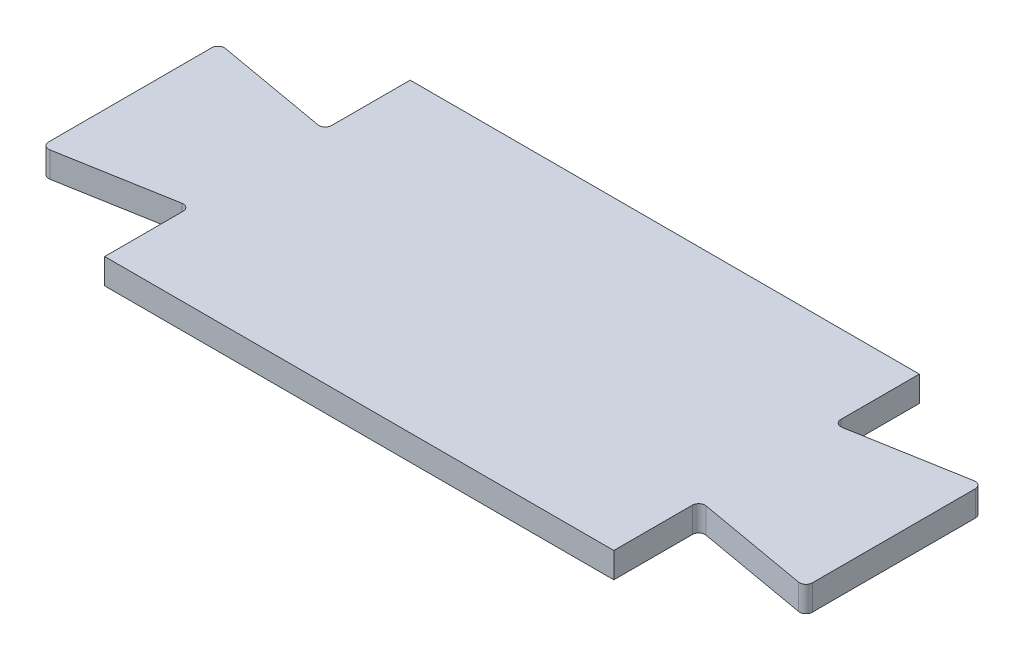
ISO-10303-21;
HEADER;
FILE_DESCRIPTION(('STEP AP214'),'2;1');
FILE_NAME('part.step','',(''),(''),'','','');
FILE_SCHEMA(('AUTOMOTIVE_DESIGN { 1 0 10303 214 1 1 1 1 }'));
ENDSEC;
DATA;
#1=APPLICATION_CONTEXT('core data for automotive mechanical design processes');
#2=APPLICATION_PROTOCOL_DEFINITION('international standard','automotive_design',2000,#1);
#3=PRODUCT_CONTEXT('',#1,'mechanical');
#4=PRODUCT('Part','Part','',(#3));
#5=PRODUCT_RELATED_PRODUCT_CATEGORY('part','',(#4));
#6=PRODUCT_DEFINITION_FORMATION('','',#4);
#7=PRODUCT_DEFINITION_CONTEXT('part definition',#1,'design');
#8=PRODUCT_DEFINITION('design','',#6,#7);
#9=PRODUCT_DEFINITION_SHAPE('','',#8);
#10=(LENGTH_UNIT() NAMED_UNIT(*) SI_UNIT(.MILLI.,.METRE.));
#11=(NAMED_UNIT(*) PLANE_ANGLE_UNIT() SI_UNIT($,.RADIAN.));
#12=(NAMED_UNIT(*) SI_UNIT($,.STERADIAN.) SOLID_ANGLE_UNIT());
#13=UNCERTAINTY_MEASURE_WITH_UNIT(LENGTH_MEASURE(1.E-05),#10,'distance_accuracy_value','');
#14=(GEOMETRIC_REPRESENTATION_CONTEXT(3) GLOBAL_UNCERTAINTY_ASSIGNED_CONTEXT((#13)) GLOBAL_UNIT_ASSIGNED_CONTEXT((#10,
#11,#12)) REPRESENTATION_CONTEXT('',''));
#15=CARTESIAN_POINT('',(0.,0.,0.));
#16=DIRECTION('',(0.,0.,1.));
#17=DIRECTION('',(1.,0.,0.));
#18=AXIS2_PLACEMENT_3D('',#15,#16,#17);
#19=CARTESIAN_POINT('',(10.,1.,-2.61836509645766));
#20=DIRECTION('',(-1.,0.,0.));
#21=DIRECTION('',(0.,0.,1.));
#22=AXIS2_PLACEMENT_3D('',#19,#20,#21);
#23=PLANE('',#22);
#24=DIRECTION('',(0.,0.,-1.));
#25=VECTOR('',#24,1.);
#26=CARTESIAN_POINT('',(10.,1.,-2.61836509645766));
#27=LINE('',#26,#25);
#28=CARTESIAN_POINT('',(10.,1.,-2.91630349460621));
#29=VERTEX_POINT('',#28);
#30=CARTESIAN_POINT('',(10.,1.,-6.));
#31=VERTEX_POINT('',#30);
#32=EDGE_CURVE('E169',#29,#31,#27,.T.);
#33=ORIENTED_EDGE('',*,*,#32,.F.);
#34=DIRECTION('',(0.,-1.,0.));
#35=VECTOR('',#34,1.);
#36=CARTESIAN_POINT('',(10.,0.,-2.91630349460621));
#37=LINE('',#36,#35);
#38=CARTESIAN_POINT('',(10.,0.,-2.91630349460621));
#39=VERTEX_POINT('',#38);
#40=EDGE_CURVE('E236',#29,#39,#37,.T.);
#41=ORIENTED_EDGE('',*,*,#40,.T.);
#42=DIRECTION('',(0.,0.,-1.));
#43=VECTOR('',#42,1.);
#44=CARTESIAN_POINT('',(10.,0.,-2.61836509645766));
#45=LINE('',#44,#43);
#46=CARTESIAN_POINT('',(10.,0.,-6.));
#47=VERTEX_POINT('',#46);
#48=EDGE_CURVE('E194',#39,#47,#45,.T.);
#49=ORIENTED_EDGE('',*,*,#48,.T.);
#50=DIRECTION('',(0.,-1.,0.));
#51=VECTOR('',#50,1.);
#52=CARTESIAN_POINT('',(10.,1.,-6.));
#53=LINE('',#52,#51);
#54=EDGE_CURVE('E187',#31,#47,#53,.T.);
#55=ORIENTED_EDGE('',*,*,#54,.F.);
#56=EDGE_LOOP('',(#33,#41,#49,#55));
#57=FACE_BOUND('',#56,.T.);
#58=ADVANCED_FACE('F33',(#57),#23,.F.);
#59=CARTESIAN_POINT('',(-10.,1.,-6.));
#60=DIRECTION('',(0.,0.,1.));
#61=DIRECTION('',(1.,0.,0.));
#62=AXIS2_PLACEMENT_3D('',#59,#60,#61);
#63=PLANE('',#62);
#64=DIRECTION('',(-1.,0.,0.));
#65=VECTOR('',#64,1.);
#66=CARTESIAN_POINT('',(-10.,0.,-6.));
#67=LINE('',#66,#65);
#68=CARTESIAN_POINT('',(-10.,0.,-6.));
#69=VERTEX_POINT('',#68);
#70=EDGE_CURVE('E305',#47,#69,#67,.T.);
#71=ORIENTED_EDGE('',*,*,#70,.T.);
#72=DIRECTION('',(0.,-1.,0.));
#73=VECTOR('',#72,1.);
#74=CARTESIAN_POINT('',(-10.,1.,-6.));
#75=LINE('',#74,#73);
#76=CARTESIAN_POINT('',(-10.,1.,-6.));
#77=VERTEX_POINT('',#76);
#78=EDGE_CURVE('E189',#77,#69,#75,.T.);
#79=ORIENTED_EDGE('',*,*,#78,.F.);
#80=DIRECTION('',(-1.,0.,0.));
#81=VECTOR('',#80,1.);
#82=CARTESIAN_POINT('',(-10.,1.,-6.));
#83=LINE('',#82,#81);
#84=EDGE_CURVE('E174',#31,#77,#83,.T.);
#85=ORIENTED_EDGE('',*,*,#84,.F.);
#86=ORIENTED_EDGE('',*,*,#54,.T.);
#87=EDGE_LOOP('',(#71,#79,#85,#86));
#88=FACE_BOUND('',#87,.T.);
#89=ADVANCED_FACE('F186',(#88),#63,.F.);
#90=CARTESIAN_POINT('',(-10.,1.,-2.61836509645766));
#91=DIRECTION('',(1.,0.,0.));
#92=DIRECTION('',(0.,0.,-1.));
#93=AXIS2_PLACEMENT_3D('',#90,#91,#92);
#94=PLANE('',#93);
#95=DIRECTION('',(0.,0.,1.));
#96=VECTOR('',#95,1.);
#97=CARTESIAN_POINT('',(-10.,0.,-2.61836509645766));
#98=LINE('',#97,#96);
#99=CARTESIAN_POINT('',(-10.,0.,-2.91630349460621));
#100=VERTEX_POINT('',#99);
#101=EDGE_CURVE('E307',#69,#100,#98,.T.);
#102=ORIENTED_EDGE('',*,*,#101,.T.);
#103=DIRECTION('',(0.,-1.,0.));
#104=VECTOR('',#103,1.);
#105=CARTESIAN_POINT('',(-10.,1.,-2.91630349460621));
#106=LINE('',#105,#104);
#107=CARTESIAN_POINT('',(-10.,1.,-2.91630349460621));
#108=VERTEX_POINT('',#107);
#109=EDGE_CURVE('E234',#100,#108,#106,.F.);
#110=ORIENTED_EDGE('',*,*,#109,.T.);
#111=DIRECTION('',(0.,0.,1.));
#112=VECTOR('',#111,1.);
#113=CARTESIAN_POINT('',(-10.,1.,-2.61836509645766));
#114=LINE('',#113,#112);
#115=EDGE_CURVE('E191',#77,#108,#114,.T.);
#116=ORIENTED_EDGE('',*,*,#115,.F.);
#117=ORIENTED_EDGE('',*,*,#78,.T.);
#118=EDGE_LOOP('',(#102,#110,#116,#117));
#119=FACE_BOUND('',#118,.T.);
#120=ADVANCED_FACE('F393',(#119),#94,.F.);
#121=CARTESIAN_POINT('',(-10.,1.,-2.61836509645766));
#122=DIRECTION('',(-0.173648177666934,0.,0.984807753012207));
#123=DIRECTION('',(0.984807753012208,0.,0.173648177666934));
#124=AXIS2_PLACEMENT_3D('',#121,#122,#123);
#125=PLANE('',#124);
#126=DIRECTION('',(-0.984807753012207,0.,-0.173648177666934));
#127=VECTOR('',#126,1.);
#128=CARTESIAN_POINT('',(-10.,0.,-2.61836509645766));
#129=LINE('',#128,#127);
#130=CARTESIAN_POINT('',(-10.2934120444168,0.,-2.67010155635316));
#131=VERTEX_POINT('',#130);
#132=CARTESIAN_POINT('',(-14.7065879555833,0.,-3.4482635401045));
#133=VERTEX_POINT('',#132);
#134=EDGE_CURVE('E310',#131,#133,#129,.T.);
#135=ORIENTED_EDGE('',*,*,#134,.T.);
#136=DIRECTION('',(0.,-1.,0.));
#137=VECTOR('',#136,1.);
#138=CARTESIAN_POINT('',(-14.7065879555833,1.,-3.4482635401045));
#139=LINE('',#138,#137);
#140=CARTESIAN_POINT('',(-14.7065879555833,1.,-3.4482635401045));
#141=VERTEX_POINT('',#140);
#142=EDGE_CURVE('E232',#133,#141,#139,.F.);
#143=ORIENTED_EDGE('',*,*,#142,.T.);
#144=DIRECTION('',(-0.984807753012207,0.,-0.173648177666934));
#145=VECTOR('',#144,1.);
#146=CARTESIAN_POINT('',(-10.,1.,-2.61836509645766));
#147=LINE('',#146,#145);
#148=CARTESIAN_POINT('',(-10.2934120444168,1.,-2.67010155635316));
#149=VERTEX_POINT('',#148);
#150=EDGE_CURVE('E352',#149,#141,#147,.T.);
#151=ORIENTED_EDGE('',*,*,#150,.F.);
#152=DIRECTION('',(0.,-1.,0.));
#153=VECTOR('',#152,1.);
#154=CARTESIAN_POINT('',(-10.2934120444168,0.,-2.67010155635316));
#155=LINE('',#154,#153);
#156=EDGE_CURVE('E229',#149,#131,#155,.T.);
#157=ORIENTED_EDGE('',*,*,#156,.T.);
#158=EDGE_LOOP('',(#135,#143,#151,#157));
#159=FACE_BOUND('',#158,.T.);
#160=ADVANCED_FACE('F366',(#159),#125,.F.);
#161=CARTESIAN_POINT('',(-15.,1.,-3.5));
#162=DIRECTION('',(1.,0.,0.));
#163=DIRECTION('',(0.,0.,-1.));
#164=AXIS2_PLACEMENT_3D('',#161,#162,#163);
#165=PLANE('',#164);
#166=DIRECTION('',(0.,0.,1.));
#167=VECTOR('',#166,1.);
#168=CARTESIAN_POINT('',(-15.,0.,-3.5));
#169=LINE('',#168,#167);
#170=CARTESIAN_POINT('',(-15.,0.,-3.20206160185145));
#171=VERTEX_POINT('',#170);
#172=CARTESIAN_POINT('',(-15.,0.,3.20206160185145));
#173=VERTEX_POINT('',#172);
#174=EDGE_CURVE('E313',#171,#173,#169,.T.);
#175=ORIENTED_EDGE('',*,*,#174,.T.);
#176=DIRECTION('',(0.,-1.,0.));
#177=VECTOR('',#176,1.);
#178=CARTESIAN_POINT('',(-15.,1.,3.20206160185145));
#179=LINE('',#178,#177);
#180=CARTESIAN_POINT('',(-15.,1.,3.20206160185145));
#181=VERTEX_POINT('',#180);
#182=EDGE_CURVE('E220',#173,#181,#179,.F.);
#183=ORIENTED_EDGE('',*,*,#182,.T.);
#184=DIRECTION('',(0.,0.,1.));
#185=VECTOR('',#184,1.);
#186=CARTESIAN_POINT('',(-15.,1.,-3.5));
#187=LINE('',#186,#185);
#188=CARTESIAN_POINT('',(-15.,1.,-3.20206160185145));
#189=VERTEX_POINT('',#188);
#190=EDGE_CURVE('E349',#189,#181,#187,.T.);
#191=ORIENTED_EDGE('',*,*,#190,.F.);
#192=DIRECTION('',(0.,-1.,0.));
#193=VECTOR('',#192,1.);
#194=CARTESIAN_POINT('',(-15.,1.,-3.20206160185145));
#195=LINE('',#194,#193);
#196=EDGE_CURVE('E217',#189,#171,#195,.T.);
#197=ORIENTED_EDGE('',*,*,#196,.T.);
#198=EDGE_LOOP('',(#175,#183,#191,#197));
#199=FACE_BOUND('',#198,.T.);
#200=ADVANCED_FACE('F376',(#199),#165,.F.);
#201=CARTESIAN_POINT('',(-10.,1.,2.61836509645766));
#202=DIRECTION('',(-0.173648177666934,0.,-0.984807753012207));
#203=DIRECTION('',(-0.984807753012208,0.,0.173648177666934));
#204=AXIS2_PLACEMENT_3D('',#201,#202,#203);
#205=PLANE('',#204);
#206=DIRECTION('',(0.984807753012207,0.,-0.173648177666934));
#207=VECTOR('',#206,1.);
#208=CARTESIAN_POINT('',(-10.,0.,2.61836509645766));
#209=LINE('',#208,#207);
#210=CARTESIAN_POINT('',(-14.7065879555833,0.,3.4482635401045));
#211=VERTEX_POINT('',#210);
#212=CARTESIAN_POINT('',(-10.2934120444168,0.,2.67010155635316));
#213=VERTEX_POINT('',#212);
#214=EDGE_CURVE('E316',#211,#213,#209,.T.);
#215=ORIENTED_EDGE('',*,*,#214,.T.);
#216=DIRECTION('',(0.,-1.,0.));
#217=VECTOR('',#216,1.);
#218=CARTESIAN_POINT('',(-10.2934120444168,1.,2.67010155635316));
#219=LINE('',#218,#217);
#220=CARTESIAN_POINT('',(-10.2934120444168,1.,2.67010155635316));
#221=VERTEX_POINT('',#220);
#222=EDGE_CURVE('E207',#213,#221,#219,.F.);
#223=ORIENTED_EDGE('',*,*,#222,.T.);
#224=DIRECTION('',(0.984807753012207,0.,-0.173648177666934));
#225=VECTOR('',#224,1.);
#226=CARTESIAN_POINT('',(-10.,1.,2.61836509645766));
#227=LINE('',#226,#225);
#228=CARTESIAN_POINT('',(-14.7065879555833,1.,3.4482635401045));
#229=VERTEX_POINT('',#228);
#230=EDGE_CURVE('E346',#229,#221,#227,.T.);
#231=ORIENTED_EDGE('',*,*,#230,.F.);
#232=DIRECTION('',(0.,-1.,0.));
#233=VECTOR('',#232,1.);
#234=CARTESIAN_POINT('',(-14.7065879555833,1.,3.4482635401045));
#235=LINE('',#234,#233);
#236=EDGE_CURVE('E199',#229,#211,#235,.T.);
#237=ORIENTED_EDGE('',*,*,#236,.T.);
#238=EDGE_LOOP('',(#215,#223,#231,#237));
#239=FACE_BOUND('',#238,.T.);
#240=ADVANCED_FACE('F345',(#239),#205,.F.);
#241=CARTESIAN_POINT('',(-10.,1.,6.));
#242=DIRECTION('',(1.,0.,0.));
#243=DIRECTION('',(0.,0.,-1.));
#244=AXIS2_PLACEMENT_3D('',#241,#242,#243);
#245=PLANE('',#244);
#246=DIRECTION('',(0.,0.,1.));
#247=VECTOR('',#246,1.);
#248=CARTESIAN_POINT('',(-10.,1.,6.));
#249=LINE('',#248,#247);
#250=CARTESIAN_POINT('',(-10.,1.,2.91630349460621));
#251=VERTEX_POINT('',#250);
#252=CARTESIAN_POINT('',(-10.,1.,6.));
#253=VERTEX_POINT('',#252);
#254=EDGE_CURVE('E337',#251,#253,#249,.T.);
#255=ORIENTED_EDGE('',*,*,#254,.F.);
#256=DIRECTION('',(0.,-1.,0.));
#257=VECTOR('',#256,1.);
#258=CARTESIAN_POINT('',(-10.,0.,2.91630349460621));
#259=LINE('',#258,#257);
#260=CARTESIAN_POINT('',(-10.,0.,2.91630349460621));
#261=VERTEX_POINT('',#260);
#262=EDGE_CURVE('E196',#251,#261,#259,.T.);
#263=ORIENTED_EDGE('',*,*,#262,.T.);
#264=DIRECTION('',(0.,0.,1.));
#265=VECTOR('',#264,1.);
#266=CARTESIAN_POINT('',(-10.,0.,6.));
#267=LINE('',#266,#265);
#268=CARTESIAN_POINT('',(-10.,0.,6.));
#269=VERTEX_POINT('',#268);
#270=EDGE_CURVE('E319',#261,#269,#267,.T.);
#271=ORIENTED_EDGE('',*,*,#270,.T.);
#272=DIRECTION('',(0.,-1.,0.));
#273=VECTOR('',#272,1.);
#274=CARTESIAN_POINT('',(-10.,1.,6.));
#275=LINE('',#274,#273);
#276=EDGE_CURVE('E201',#253,#269,#275,.T.);
#277=ORIENTED_EDGE('',*,*,#276,.F.);
#278=EDGE_LOOP('',(#255,#263,#271,#277));
#279=FACE_BOUND('',#278,.T.);
#280=ADVANCED_FACE('F335',(#279),#245,.F.);
#281=CARTESIAN_POINT('',(-10.,1.,6.));
#282=DIRECTION('',(0.,0.,-1.));
#283=DIRECTION('',(-1.,0.,0.));
#284=AXIS2_PLACEMENT_3D('',#281,#282,#283);
#285=PLANE('',#284);
#286=DIRECTION('',(1.,0.,0.));
#287=VECTOR('',#286,1.);
#288=CARTESIAN_POINT('',(-10.,0.,6.));
#289=LINE('',#288,#287);
#290=CARTESIAN_POINT('',(10.,0.,6.));
#291=VERTEX_POINT('',#290);
#292=EDGE_CURVE('E284',#269,#291,#289,.T.);
#293=ORIENTED_EDGE('',*,*,#292,.T.);
#294=DIRECTION('',(0.,-1.,0.));
#295=VECTOR('',#294,1.);
#296=CARTESIAN_POINT('',(10.,1.,6.));
#297=LINE('',#296,#295);
#298=CARTESIAN_POINT('',(10.,1.,6.));
#299=VERTEX_POINT('',#298);
#300=EDGE_CURVE('E283',#299,#291,#297,.T.);
#301=ORIENTED_EDGE('',*,*,#300,.F.);
#302=DIRECTION('',(1.,0.,0.));
#303=VECTOR('',#302,1.);
#304=CARTESIAN_POINT('',(-10.,1.,6.));
#305=LINE('',#304,#303);
#306=EDGE_CURVE('E299',#253,#299,#305,.T.);
#307=ORIENTED_EDGE('',*,*,#306,.F.);
#308=ORIENTED_EDGE('',*,*,#276,.T.);
#309=EDGE_LOOP('',(#293,#301,#307,#308));
#310=FACE_BOUND('',#309,.T.);
#311=ADVANCED_FACE('F331',(#310),#285,.F.);
#312=CARTESIAN_POINT('',(10.,1.,6.));
#313=DIRECTION('',(-1.,0.,0.));
#314=DIRECTION('',(0.,0.,1.));
#315=AXIS2_PLACEMENT_3D('',#312,#313,#314);
#316=PLANE('',#315);
#317=DIRECTION('',(0.,0.,-1.));
#318=VECTOR('',#317,1.);
#319=CARTESIAN_POINT('',(10.,0.,6.));
#320=LINE('',#319,#318);
#321=CARTESIAN_POINT('',(10.,0.,2.91630349460621));
#322=VERTEX_POINT('',#321);
#323=EDGE_CURVE('E271',#291,#322,#320,.T.);
#324=ORIENTED_EDGE('',*,*,#323,.T.);
#325=DIRECTION('',(0.,-1.,0.));
#326=VECTOR('',#325,1.);
#327=CARTESIAN_POINT('',(10.,1.,2.91630349460621));
#328=LINE('',#327,#326);
#329=CARTESIAN_POINT('',(10.,1.,2.91630349460621));
#330=VERTEX_POINT('',#329);
#331=EDGE_CURVE('E252',#322,#330,#328,.F.);
#332=ORIENTED_EDGE('',*,*,#331,.T.);
#333=DIRECTION('',(0.,0.,-1.));
#334=VECTOR('',#333,1.);
#335=CARTESIAN_POINT('',(10.,1.,6.));
#336=LINE('',#335,#334);
#337=EDGE_CURVE('E291',#299,#330,#336,.T.);
#338=ORIENTED_EDGE('',*,*,#337,.F.);
#339=ORIENTED_EDGE('',*,*,#300,.T.);
#340=EDGE_LOOP('',(#324,#332,#338,#339));
#341=FACE_BOUND('',#340,.T.);
#342=ADVANCED_FACE('F279',(#341),#316,.F.);
#343=CARTESIAN_POINT('',(10.,1.,2.61836509645766));
#344=DIRECTION('',(0.173648177666934,0.,-0.984807753012207));
#345=DIRECTION('',(-0.984807753012208,0.,-0.173648177666934));
#346=AXIS2_PLACEMENT_3D('',#343,#344,#345);
#347=PLANE('',#346);
#348=DIRECTION('',(0.984807753012207,0.,0.173648177666934));
#349=VECTOR('',#348,1.);
#350=CARTESIAN_POINT('',(10.,0.,2.61836509645766));
#351=LINE('',#350,#349);
#352=CARTESIAN_POINT('',(10.2934120444168,0.,2.67010155635316));
#353=VERTEX_POINT('',#352);
#354=CARTESIAN_POINT('',(14.7065879555833,0.,3.4482635401045));
#355=VERTEX_POINT('',#354);
#356=EDGE_CURVE('E273',#353,#355,#351,.T.);
#357=ORIENTED_EDGE('',*,*,#356,.T.);
#358=DIRECTION('',(0.,-1.,0.));
#359=VECTOR('',#358,1.);
#360=CARTESIAN_POINT('',(14.7065879555833,1.,3.4482635401045));
#361=LINE('',#360,#359);
#362=CARTESIAN_POINT('',(14.7065879555833,1.,3.4482635401045));
#363=VERTEX_POINT('',#362);
#364=EDGE_CURVE('E250',#355,#363,#361,.F.);
#365=ORIENTED_EDGE('',*,*,#364,.T.);
#366=DIRECTION('',(0.984807753012207,0.,0.173648177666934));
#367=VECTOR('',#366,1.);
#368=CARTESIAN_POINT('',(10.,1.,2.61836509645766));
#369=LINE('',#368,#367);
#370=CARTESIAN_POINT('',(10.2934120444168,1.,2.67010155635316));
#371=VERTEX_POINT('',#370);
#372=EDGE_CURVE('E289',#371,#363,#369,.T.);
#373=ORIENTED_EDGE('',*,*,#372,.F.);
#374=DIRECTION('',(0.,-1.,0.));
#375=VECTOR('',#374,1.);
#376=CARTESIAN_POINT('',(10.2934120444168,0.,2.67010155635316));
#377=LINE('',#376,#375);
#378=EDGE_CURVE('E247',#371,#353,#377,.T.);
#379=ORIENTED_EDGE('',*,*,#378,.T.);
#380=EDGE_LOOP('',(#357,#365,#373,#379));
#381=FACE_BOUND('',#380,.T.);
#382=ADVANCED_FACE('F293',(#381),#347,.F.);
#383=CARTESIAN_POINT('',(15.,1.,-3.50000000000001));
#384=DIRECTION('',(-1.,0.,0.));
#385=DIRECTION('',(0.,0.,1.));
#386=AXIS2_PLACEMENT_3D('',#383,#384,#385);
#387=PLANE('',#386);
#388=DIRECTION('',(0.,0.,-1.));
#389=VECTOR('',#388,1.);
#390=CARTESIAN_POINT('',(15.,0.,-3.50000000000001));
#391=LINE('',#390,#389);
#392=CARTESIAN_POINT('',(15.,0.,3.20206160185145));
#393=VERTEX_POINT('',#392);
#394=CARTESIAN_POINT('',(15.,0.,-3.20206160185145));
#395=VERTEX_POINT('',#394);
#396=EDGE_CURVE('E323',#393,#395,#391,.T.);
#397=ORIENTED_EDGE('',*,*,#396,.T.);
#398=DIRECTION('',(0.,-1.,0.));
#399=VECTOR('',#398,1.);
#400=CARTESIAN_POINT('',(15.,1.,-3.20206160185145));
#401=LINE('',#400,#399);
#402=CARTESIAN_POINT('',(15.,1.,-3.20206160185145));
#403=VERTEX_POINT('',#402);
#404=EDGE_CURVE('E245',#395,#403,#401,.F.);
#405=ORIENTED_EDGE('',*,*,#404,.T.);
#406=DIRECTION('',(0.,0.,-1.));
#407=VECTOR('',#406,1.);
#408=CARTESIAN_POINT('',(15.,1.,-3.50000000000001));
#409=LINE('',#408,#407);
#410=CARTESIAN_POINT('',(15.,1.,3.20206160185145));
#411=VERTEX_POINT('',#410);
#412=EDGE_CURVE('E295',#411,#403,#409,.T.);
#413=ORIENTED_EDGE('',*,*,#412,.F.);
#414=DIRECTION('',(0.,-1.,0.));
#415=VECTOR('',#414,1.);
#416=CARTESIAN_POINT('',(15.,1.,3.20206160185145));
#417=LINE('',#416,#415);
#418=EDGE_CURVE('E242',#411,#393,#417,.T.);
#419=ORIENTED_EDGE('',*,*,#418,.T.);
#420=EDGE_LOOP('',(#397,#405,#413,#419));
#421=FACE_BOUND('',#420,.T.);
#422=ADVANCED_FACE('F412',(#421),#387,.F.);
#423=CARTESIAN_POINT('',(10.,1.,-2.61836509645766));
#424=DIRECTION('',(0.173648177666934,0.,0.984807753012207));
#425=DIRECTION('',(0.984807753012207,0.,-0.173648177666934));
#426=AXIS2_PLACEMENT_3D('',#423,#424,#425);
#427=PLANE('',#426);
#428=DIRECTION('',(-0.984807753012207,0.,0.173648177666934));
#429=VECTOR('',#428,1.);
#430=CARTESIAN_POINT('',(10.,0.,-2.61836509645766));
#431=LINE('',#430,#429);
#432=CARTESIAN_POINT('',(14.7065879555833,0.,-3.4482635401045));
#433=VERTEX_POINT('',#432);
#434=CARTESIAN_POINT('',(10.2934120444168,0.,-2.67010155635316));
#435=VERTEX_POINT('',#434);
#436=EDGE_CURVE('E182',#433,#435,#431,.T.);
#437=ORIENTED_EDGE('',*,*,#436,.T.);
#438=DIRECTION('',(0.,-1.,0.));
#439=VECTOR('',#438,1.);
#440=CARTESIAN_POINT('',(10.2934120444168,1.,-2.67010155635316));
#441=LINE('',#440,#439);
#442=CARTESIAN_POINT('',(10.2934120444168,1.,-2.67010155635316));
#443=VERTEX_POINT('',#442);
#444=EDGE_CURVE('E48',#435,#443,#441,.F.);
#445=ORIENTED_EDGE('',*,*,#444,.T.);
#446=DIRECTION('',(-0.984807753012207,0.,0.173648177666934));
#447=VECTOR('',#446,1.);
#448=CARTESIAN_POINT('',(10.,1.,-2.61836509645766));
#449=LINE('',#448,#447);
#450=CARTESIAN_POINT('',(14.7065879555833,1.,-3.4482635401045));
#451=VERTEX_POINT('',#450);
#452=EDGE_CURVE('E297',#451,#443,#449,.T.);
#453=ORIENTED_EDGE('',*,*,#452,.F.);
#454=DIRECTION('',(0.,-1.,0.));
#455=VECTOR('',#454,1.);
#456=CARTESIAN_POINT('',(14.7065879555833,1.,-3.4482635401045));
#457=LINE('',#456,#455);
#458=EDGE_CURVE('E238',#451,#433,#457,.T.);
#459=ORIENTED_EDGE('',*,*,#458,.T.);
#460=EDGE_LOOP('',(#437,#445,#453,#459));
#461=FACE_BOUND('',#460,.T.);
#462=ADVANCED_FACE('F415',(#461),#427,.F.);
#463=CARTESIAN_POINT('',(0.,1.,0.));
#464=DIRECTION('',(0.,-1.,0.));
#465=DIRECTION('',(0.,0.,-1.));
#466=AXIS2_PLACEMENT_3D('',#463,#464,#465);
#467=PLANE('',#466);
#468=ORIENTED_EDGE('',*,*,#190,.T.);
#469=CARTESIAN_POINT('',(-14.75,1.,3.20206160185145));
#470=DIRECTION('',(0.,-1.,0.));
#471=DIRECTION('',(0.,0.,-1.));
#472=AXIS2_PLACEMENT_3D('',#469,#470,#471);
#473=CIRCLE('',#472,0.25);
#474=EDGE_CURVE('E227',#181,#229,#473,.F.);
#475=ORIENTED_EDGE('',*,*,#474,.T.);
#476=ORIENTED_EDGE('',*,*,#230,.T.);
#477=CARTESIAN_POINT('',(-10.25,1.,2.91630349460621));
#478=DIRECTION('',(0.,-1.,0.));
#479=DIRECTION('',(0.,0.,-1.));
#480=AXIS2_PLACEMENT_3D('',#477,#478,#479);
#481=CIRCLE('',#480,0.25);
#482=EDGE_CURVE('E256',#221,#251,#481,.T.);
#483=ORIENTED_EDGE('',*,*,#482,.T.);
#484=ORIENTED_EDGE('',*,*,#254,.T.);
#485=ORIENTED_EDGE('',*,*,#306,.T.);
#486=ORIENTED_EDGE('',*,*,#337,.T.);
#487=CARTESIAN_POINT('',(10.25,1.,2.91630349460621));
#488=DIRECTION('',(0.,-1.,0.));
#489=DIRECTION('',(0.,0.,-1.));
#490=AXIS2_PLACEMENT_3D('',#487,#488,#489);
#491=CIRCLE('',#490,0.25);
#492=EDGE_CURVE('E11',#330,#371,#491,.T.);
#493=ORIENTED_EDGE('',*,*,#492,.T.);
#494=ORIENTED_EDGE('',*,*,#372,.T.);
#495=CARTESIAN_POINT('',(14.75,1.,3.20206160185145));
#496=DIRECTION('',(0.,-1.,0.));
#497=DIRECTION('',(0.,0.,-1.));
#498=AXIS2_PLACEMENT_3D('',#495,#496,#497);
#499=CIRCLE('',#498,0.25);
#500=EDGE_CURVE('E222',#363,#411,#499,.F.);
#501=ORIENTED_EDGE('',*,*,#500,.T.);
#502=ORIENTED_EDGE('',*,*,#412,.T.);
#503=CARTESIAN_POINT('',(14.75,1.,-3.20206160185145));
#504=DIRECTION('',(0.,-1.,0.));
#505=DIRECTION('',(0.,0.,-1.));
#506=AXIS2_PLACEMENT_3D('',#503,#504,#505);
#507=CIRCLE('',#506,0.25);
#508=EDGE_CURVE('E55',#403,#451,#507,.F.);
#509=ORIENTED_EDGE('',*,*,#508,.T.);
#510=ORIENTED_EDGE('',*,*,#452,.T.);
#511=CARTESIAN_POINT('',(10.25,1.,-2.91630349460621));
#512=DIRECTION('',(0.,-1.,0.));
#513=DIRECTION('',(0.,0.,-1.));
#514=AXIS2_PLACEMENT_3D('',#511,#512,#513);
#515=CIRCLE('',#514,0.25);
#516=EDGE_CURVE('E177',#443,#29,#515,.T.);
#517=ORIENTED_EDGE('',*,*,#516,.T.);
#518=ORIENTED_EDGE('',*,*,#32,.T.);
#519=ORIENTED_EDGE('',*,*,#84,.T.);
#520=ORIENTED_EDGE('',*,*,#115,.T.);
#521=CARTESIAN_POINT('',(-10.25,1.,-2.91630349460621));
#522=DIRECTION('',(0.,-1.,0.));
#523=DIRECTION('',(0.,0.,-1.));
#524=AXIS2_PLACEMENT_3D('',#521,#522,#523);
#525=CIRCLE('',#524,0.25);
#526=EDGE_CURVE('E260',#108,#149,#525,.T.);
#527=ORIENTED_EDGE('',*,*,#526,.T.);
#528=ORIENTED_EDGE('',*,*,#150,.T.);
#529=CARTESIAN_POINT('',(-14.75,1.,-3.20206160185145));
#530=DIRECTION('',(0.,-1.,0.));
#531=DIRECTION('',(0.,0.,-1.));
#532=AXIS2_PLACEMENT_3D('',#529,#530,#531);
#533=CIRCLE('',#532,0.25);
#534=EDGE_CURVE('E225',#141,#189,#533,.F.);
#535=ORIENTED_EDGE('',*,*,#534,.T.);
#536=EDGE_LOOP('',(#468,#475,#476,#483,#484,#485,#486,#493,#494,#501,#502,#509,#510,#517,#518,
#519,#520,#527,#528,#535));
#537=FACE_BOUND('',#536,.T.);
#538=ADVANCED_FACE('F172',(#537),#467,.F.);
#539=CARTESIAN_POINT('',(0.,0.,0.));
#540=DIRECTION('',(0.,-1.,0.));
#541=DIRECTION('',(0.,0.,-1.));
#542=AXIS2_PLACEMENT_3D('',#539,#540,#541);
#543=PLANE('',#542);
#544=ORIENTED_EDGE('',*,*,#214,.F.);
#545=CARTESIAN_POINT('',(-14.75,0.,3.20206160185145));
#546=DIRECTION('',(0.,-1.,0.));
#547=DIRECTION('',(0.,0.,-1.));
#548=AXIS2_PLACEMENT_3D('',#545,#546,#547);
#549=CIRCLE('',#548,0.25);
#550=EDGE_CURVE('E215',#211,#173,#549,.T.);
#551=ORIENTED_EDGE('',*,*,#550,.T.);
#552=ORIENTED_EDGE('',*,*,#174,.F.);
#553=CARTESIAN_POINT('',(-14.75,0.,-3.20206160185145));
#554=DIRECTION('',(0.,-1.,0.));
#555=DIRECTION('',(0.,0.,-1.));
#556=AXIS2_PLACEMENT_3D('',#553,#554,#555);
#557=CIRCLE('',#556,0.25);
#558=EDGE_CURVE('E213',#171,#133,#557,.T.);
#559=ORIENTED_EDGE('',*,*,#558,.T.);
#560=ORIENTED_EDGE('',*,*,#134,.F.);
#561=CARTESIAN_POINT('',(-10.25,0.,-2.91630349460621));
#562=DIRECTION('',(0.,-1.,0.));
#563=DIRECTION('',(0.,0.,-1.));
#564=AXIS2_PLACEMENT_3D('',#561,#562,#563);
#565=CIRCLE('',#564,0.25);
#566=EDGE_CURVE('E258',#131,#100,#565,.F.);
#567=ORIENTED_EDGE('',*,*,#566,.T.);
#568=ORIENTED_EDGE('',*,*,#101,.F.);
#569=ORIENTED_EDGE('',*,*,#70,.F.);
#570=ORIENTED_EDGE('',*,*,#48,.F.);
#571=CARTESIAN_POINT('',(10.25,0.,-2.91630349460621));
#572=DIRECTION('',(0.,-1.,0.));
#573=DIRECTION('',(0.,0.,-1.));
#574=AXIS2_PLACEMENT_3D('',#571,#572,#573);
#575=CIRCLE('',#574,0.25);
#576=EDGE_CURVE('E262',#39,#435,#575,.F.);
#577=ORIENTED_EDGE('',*,*,#576,.T.);
#578=ORIENTED_EDGE('',*,*,#436,.F.);
#579=CARTESIAN_POINT('',(14.75,0.,-3.20206160185145));
#580=DIRECTION('',(0.,-1.,0.));
#581=DIRECTION('',(0.,0.,-1.));
#582=AXIS2_PLACEMENT_3D('',#579,#580,#581);
#583=CIRCLE('',#582,0.25);
#584=EDGE_CURVE('E211',#433,#395,#583,.T.);
#585=ORIENTED_EDGE('',*,*,#584,.T.);
#586=ORIENTED_EDGE('',*,*,#396,.F.);
#587=CARTESIAN_POINT('',(14.75,0.,3.20206160185145));
#588=DIRECTION('',(0.,-1.,0.));
#589=DIRECTION('',(0.,0.,-1.));
#590=AXIS2_PLACEMENT_3D('',#587,#588,#589);
#591=CIRCLE('',#590,0.25);
#592=EDGE_CURVE('E209',#393,#355,#591,.T.);
#593=ORIENTED_EDGE('',*,*,#592,.T.);
#594=ORIENTED_EDGE('',*,*,#356,.F.);
#595=CARTESIAN_POINT('',(10.25,0.,2.91630349460621));
#596=DIRECTION('',(0.,-1.,0.));
#597=DIRECTION('',(0.,0.,-1.));
#598=AXIS2_PLACEMENT_3D('',#595,#596,#597);
#599=CIRCLE('',#598,0.25);
#600=EDGE_CURVE('E41',#353,#322,#599,.F.);
#601=ORIENTED_EDGE('',*,*,#600,.T.);
#602=ORIENTED_EDGE('',*,*,#323,.F.);
#603=ORIENTED_EDGE('',*,*,#292,.F.);
#604=ORIENTED_EDGE('',*,*,#270,.F.);
#605=CARTESIAN_POINT('',(-10.25,0.,2.91630349460621));
#606=DIRECTION('',(0.,-1.,0.));
#607=DIRECTION('',(0.,0.,-1.));
#608=AXIS2_PLACEMENT_3D('',#605,#606,#607);
#609=CIRCLE('',#608,0.25);
#610=EDGE_CURVE('E254',#261,#213,#609,.F.);
#611=ORIENTED_EDGE('',*,*,#610,.T.);
#612=EDGE_LOOP('',(#544,#551,#552,#559,#560,#567,#568,#569,#570,#577,#578,#585,#586,#593,#594,
#601,#602,#603,#604,#611));
#613=FACE_BOUND('',#612,.T.);
#614=ADVANCED_FACE('F269',(#613),#543,.T.);
#615=CARTESIAN_POINT('',(-10.25,1.,2.91630349460621));
#616=DIRECTION('',(0.,1.,0.));
#617=DIRECTION('',(0.,0.,1.));
#618=AXIS2_PLACEMENT_3D('',#615,#616,#617);
#619=CYLINDRICAL_SURFACE('',#618,0.25);
#620=ORIENTED_EDGE('',*,*,#482,.F.);
#621=ORIENTED_EDGE('',*,*,#222,.F.);
#622=ORIENTED_EDGE('',*,*,#610,.F.);
#623=ORIENTED_EDGE('',*,*,#262,.F.);
#624=EDGE_LOOP('',(#620,#621,#622,#623));
#625=FACE_BOUND('',#624,.T.);
#626=ADVANCED_FACE('F340',(#625),#619,.F.);
#627=CARTESIAN_POINT('',(-14.75,1.,3.20206160185145));
#628=DIRECTION('',(0.,-1.,0.));
#629=DIRECTION('',(0.,0.,-1.));
#630=AXIS2_PLACEMENT_3D('',#627,#628,#629);
#631=CYLINDRICAL_SURFACE('',#630,0.25);
#632=ORIENTED_EDGE('',*,*,#474,.F.);
#633=ORIENTED_EDGE('',*,*,#182,.F.);
#634=ORIENTED_EDGE('',*,*,#550,.F.);
#635=ORIENTED_EDGE('',*,*,#236,.F.);
#636=EDGE_LOOP('',(#632,#633,#634,#635));
#637=FACE_BOUND('',#636,.T.);
#638=ADVANCED_FACE('F379',(#637),#631,.T.);
#639=CARTESIAN_POINT('',(-14.75,1.,-3.20206160185145));
#640=DIRECTION('',(0.,-1.,0.));
#641=DIRECTION('',(0.,0.,-1.));
#642=AXIS2_PLACEMENT_3D('',#639,#640,#641);
#643=CYLINDRICAL_SURFACE('',#642,0.25);
#644=ORIENTED_EDGE('',*,*,#534,.F.);
#645=ORIENTED_EDGE('',*,*,#142,.F.);
#646=ORIENTED_EDGE('',*,*,#558,.F.);
#647=ORIENTED_EDGE('',*,*,#196,.F.);
#648=EDGE_LOOP('',(#644,#645,#646,#647));
#649=FACE_BOUND('',#648,.T.);
#650=ADVANCED_FACE('F373',(#649),#643,.T.);
#651=CARTESIAN_POINT('',(-10.25,1.,-2.91630349460621));
#652=DIRECTION('',(0.,1.,0.));
#653=DIRECTION('',(0.,0.,1.));
#654=AXIS2_PLACEMENT_3D('',#651,#652,#653);
#655=CYLINDRICAL_SURFACE('',#654,0.25);
#656=ORIENTED_EDGE('',*,*,#526,.F.);
#657=ORIENTED_EDGE('',*,*,#109,.F.);
#658=ORIENTED_EDGE('',*,*,#566,.F.);
#659=ORIENTED_EDGE('',*,*,#156,.F.);
#660=EDGE_LOOP('',(#656,#657,#658,#659));
#661=FACE_BOUND('',#660,.T.);
#662=ADVANCED_FACE('F363',(#661),#655,.F.);
#663=CARTESIAN_POINT('',(10.25,1.,-2.91630349460621));
#664=DIRECTION('',(0.,1.,0.));
#665=DIRECTION('',(0.,0.,1.));
#666=AXIS2_PLACEMENT_3D('',#663,#664,#665);
#667=CYLINDRICAL_SURFACE('',#666,0.25);
#668=ORIENTED_EDGE('',*,*,#516,.F.);
#669=ORIENTED_EDGE('',*,*,#444,.F.);
#670=ORIENTED_EDGE('',*,*,#576,.F.);
#671=ORIENTED_EDGE('',*,*,#40,.F.);
#672=EDGE_LOOP('',(#668,#669,#670,#671));
#673=FACE_BOUND('',#672,.T.);
#674=ADVANCED_FACE('F453',(#673),#667,.F.);
#675=CARTESIAN_POINT('',(14.75,1.,-3.20206160185145));
#676=DIRECTION('',(0.,-1.,0.));
#677=DIRECTION('',(0.,0.,-1.));
#678=AXIS2_PLACEMENT_3D('',#675,#676,#677);
#679=CYLINDRICAL_SURFACE('',#678,0.25);
#680=ORIENTED_EDGE('',*,*,#508,.F.);
#681=ORIENTED_EDGE('',*,*,#404,.F.);
#682=ORIENTED_EDGE('',*,*,#584,.F.);
#683=ORIENTED_EDGE('',*,*,#458,.F.);
#684=EDGE_LOOP('',(#680,#681,#682,#683));
#685=FACE_BOUND('',#684,.T.);
#686=ADVANCED_FACE('F462',(#685),#679,.T.);
#687=CARTESIAN_POINT('',(14.75,1.,3.20206160185145));
#688=DIRECTION('',(0.,-1.,0.));
#689=DIRECTION('',(0.,0.,-1.));
#690=AXIS2_PLACEMENT_3D('',#687,#688,#689);
#691=CYLINDRICAL_SURFACE('',#690,0.25);
#692=ORIENTED_EDGE('',*,*,#500,.F.);
#693=ORIENTED_EDGE('',*,*,#364,.F.);
#694=ORIENTED_EDGE('',*,*,#592,.F.);
#695=ORIENTED_EDGE('',*,*,#418,.F.);
#696=EDGE_LOOP('',(#692,#693,#694,#695));
#697=FACE_BOUND('',#696,.T.);
#698=ADVANCED_FACE('F472',(#697),#691,.T.);
#699=CARTESIAN_POINT('',(10.25,1.,2.91630349460621));
#700=DIRECTION('',(0.,1.,0.));
#701=DIRECTION('',(0.,0.,1.));
#702=AXIS2_PLACEMENT_3D('',#699,#700,#701);
#703=CYLINDRICAL_SURFACE('',#702,0.25);
#704=ORIENTED_EDGE('',*,*,#492,.F.);
#705=ORIENTED_EDGE('',*,*,#331,.F.);
#706=ORIENTED_EDGE('',*,*,#600,.F.);
#707=ORIENTED_EDGE('',*,*,#378,.F.);
#708=EDGE_LOOP('',(#704,#705,#706,#707));
#709=FACE_BOUND('',#708,.T.);
#710=ADVANCED_FACE('F35',(#709),#703,.F.);
#711=CLOSED_SHELL('',(#58,#89,#120,#160,#200,#240,#280,#311,#342,#382,#422,#462,#538,#614,#626,
#638,#650,#662,#674,#686,#698,#710));
#712=MANIFOLD_SOLID_BREP('B2',#711);
#713=ADVANCED_BREP_SHAPE_REPRESENTATION('',(#18,#712),#14);
#714=SHAPE_DEFINITION_REPRESENTATION(#9,#713);
ENDSEC;
END-ISO-10303-21;
